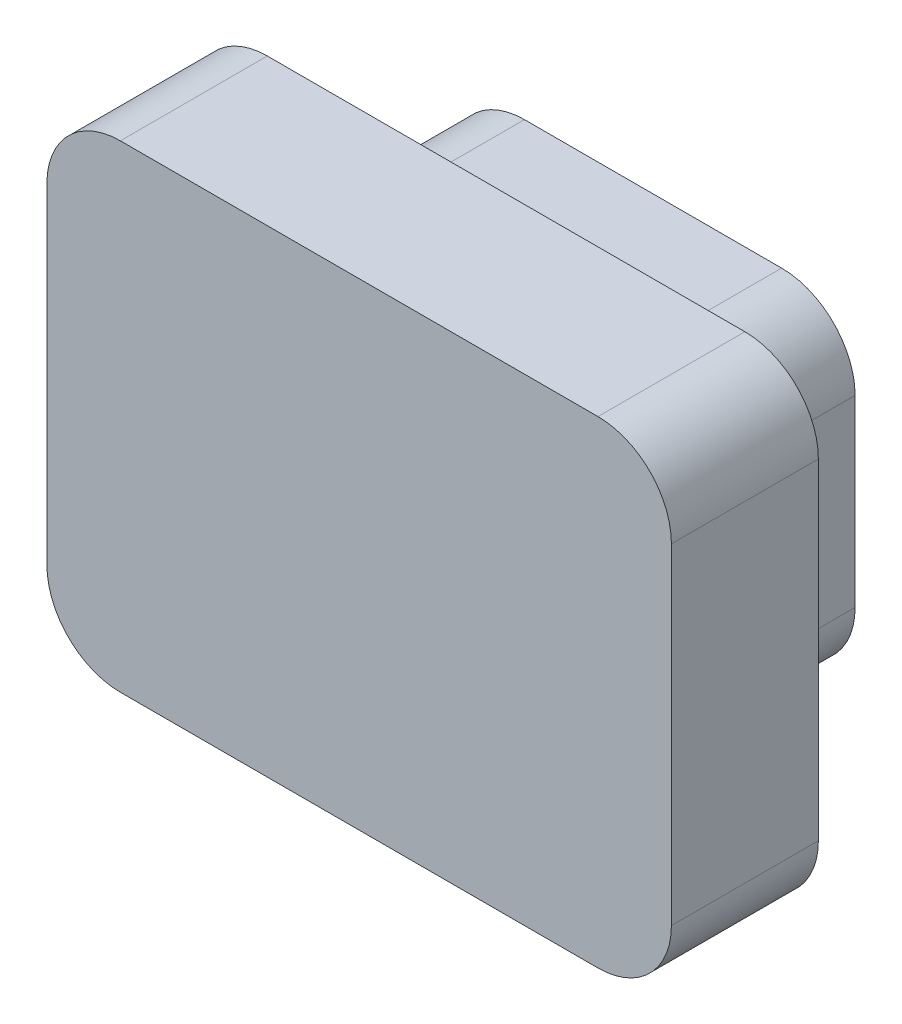
ISO-10303-21;
HEADER;
FILE_DESCRIPTION(('STEP AP214'),'2;1');
FILE_NAME('part.step','',(''),(''),'','','');
FILE_SCHEMA(('AUTOMOTIVE_DESIGN { 1 0 10303 214 1 1 1 1 }'));
ENDSEC;
DATA;
#1=APPLICATION_CONTEXT('core data for automotive mechanical design processes');
#2=APPLICATION_PROTOCOL_DEFINITION('international standard','automotive_design',2000,#1);
#3=PRODUCT_CONTEXT('',#1,'mechanical');
#4=PRODUCT('Part','Part','',(#3));
#5=PRODUCT_RELATED_PRODUCT_CATEGORY('part','',(#4));
#6=PRODUCT_DEFINITION_FORMATION('','',#4);
#7=PRODUCT_DEFINITION_CONTEXT('part definition',#1,'design');
#8=PRODUCT_DEFINITION('design','',#6,#7);
#9=PRODUCT_DEFINITION_SHAPE('','',#8);
#10=(LENGTH_UNIT() NAMED_UNIT(*) SI_UNIT(.MILLI.,.METRE.));
#11=(NAMED_UNIT(*) PLANE_ANGLE_UNIT() SI_UNIT($,.RADIAN.));
#12=(NAMED_UNIT(*) SI_UNIT($,.STERADIAN.) SOLID_ANGLE_UNIT());
#13=UNCERTAINTY_MEASURE_WITH_UNIT(LENGTH_MEASURE(1.E-05),#10,'distance_accuracy_value','');
#14=(GEOMETRIC_REPRESENTATION_CONTEXT(3) GLOBAL_UNCERTAINTY_ASSIGNED_CONTEXT((#13)) GLOBAL_UNIT_ASSIGNED_CONTEXT((#10,
#11,#12)) REPRESENTATION_CONTEXT('',''));
#15=CARTESIAN_POINT('',(0.,0.,0.));
#16=DIRECTION('',(0.,0.,1.));
#17=DIRECTION('',(1.,0.,0.));
#18=AXIS2_PLACEMENT_3D('',#15,#16,#17);
#19=CARTESIAN_POINT('',(1.75,-1.25,2.));
#20=DIRECTION('',(0.,0.,-1.));
#21=DIRECTION('',(-1.,0.,0.));
#22=AXIS2_PLACEMENT_3D('',#19,#20,#21);
#23=CYLINDRICAL_SURFACE('',#22,1.);
#24=CARTESIAN_POINT('',(1.75,-1.25,0.));
#25=DIRECTION('',(0.,0.,1.));
#26=DIRECTION('',(1.,0.,0.));
#27=AXIS2_PLACEMENT_3D('',#24,#25,#26);
#28=CIRCLE('',#27,1.);
#29=CARTESIAN_POINT('',(1.75,-2.25,0.));
#30=VERTEX_POINT('',#29);
#31=CARTESIAN_POINT('',(2.75,-1.25,0.));
#32=VERTEX_POINT('',#31);
#33=EDGE_CURVE('E144',#30,#32,#28,.T.);
#34=ORIENTED_EDGE('',*,*,#33,.T.);
#35=DIRECTION('',(0.,0.,-1.));
#36=VECTOR('',#35,1.);
#37=CARTESIAN_POINT('',(2.75,-1.25,2.));
#38=LINE('',#37,#36);
#39=CARTESIAN_POINT('',(2.75,-1.25,2.));
#40=VERTEX_POINT('',#39);
#41=EDGE_CURVE('E11',#40,#32,#38,.T.);
#42=ORIENTED_EDGE('',*,*,#41,.F.);
#43=CARTESIAN_POINT('',(1.75,-1.25,2.));
#44=DIRECTION('',(0.,0.,1.));
#45=DIRECTION('',(1.,0.,0.));
#46=AXIS2_PLACEMENT_3D('',#43,#44,#45);
#47=CIRCLE('',#46,1.);
#48=CARTESIAN_POINT('',(1.75,-2.25,2.));
#49=VERTEX_POINT('',#48);
#50=EDGE_CURVE('E159',#49,#40,#47,.T.);
#51=ORIENTED_EDGE('',*,*,#50,.F.);
#52=DIRECTION('',(0.,0.,-1.));
#53=VECTOR('',#52,1.);
#54=CARTESIAN_POINT('',(1.75,-2.25,2.));
#55=LINE('',#54,#53);
#56=EDGE_CURVE('E143',#49,#30,#55,.T.);
#57=ORIENTED_EDGE('',*,*,#56,.T.);
#58=EDGE_LOOP('',(#34,#42,#51,#57));
#59=FACE_BOUND('',#58,.T.);
#60=ADVANCED_FACE('F36',(#59),#23,.T.);
#61=CARTESIAN_POINT('',(2.75,-1.25,2.));
#62=DIRECTION('',(-1.,0.,0.));
#63=DIRECTION('',(0.,0.,1.));
#64=AXIS2_PLACEMENT_3D('',#61,#62,#63);
#65=PLANE('',#64);
#66=DIRECTION('',(0.,1.,0.));
#67=VECTOR('',#66,1.);
#68=CARTESIAN_POINT('',(2.75,-1.25,0.));
#69=LINE('',#68,#67);
#70=CARTESIAN_POINT('',(2.75,1.25,0.));
#71=VERTEX_POINT('',#70);
#72=EDGE_CURVE('E147',#32,#71,#69,.T.);
#73=ORIENTED_EDGE('',*,*,#72,.T.);
#74=DIRECTION('',(0.,0.,-1.));
#75=VECTOR('',#74,1.);
#76=CARTESIAN_POINT('',(2.75,1.25,2.));
#77=LINE('',#76,#75);
#78=CARTESIAN_POINT('',(2.75,1.25,2.));
#79=VERTEX_POINT('',#78);
#80=EDGE_CURVE('E44',#79,#71,#77,.T.);
#81=ORIENTED_EDGE('',*,*,#80,.F.);
#82=DIRECTION('',(0.,1.,0.));
#83=VECTOR('',#82,1.);
#84=CARTESIAN_POINT('',(2.75,-1.25,2.));
#85=LINE('',#84,#83);
#86=EDGE_CURVE('E94',#40,#79,#85,.T.);
#87=ORIENTED_EDGE('',*,*,#86,.F.);
#88=ORIENTED_EDGE('',*,*,#41,.T.);
#89=EDGE_LOOP('',(#73,#81,#87,#88));
#90=FACE_BOUND('',#89,.T.);
#91=ADVANCED_FACE('F305',(#90),#65,.F.);
#92=CARTESIAN_POINT('',(1.75,1.25,2.));
#93=DIRECTION('',(0.,0.,-1.));
#94=DIRECTION('',(-1.,0.,0.));
#95=AXIS2_PLACEMENT_3D('',#92,#93,#94);
#96=CYLINDRICAL_SURFACE('',#95,1.);
#97=CARTESIAN_POINT('',(1.75,1.25,0.));
#98=DIRECTION('',(0.,0.,1.));
#99=DIRECTION('',(1.,0.,0.));
#100=AXIS2_PLACEMENT_3D('',#97,#98,#99);
#101=CIRCLE('',#100,1.);
#102=CARTESIAN_POINT('',(1.75,2.25,0.));
#103=VERTEX_POINT('',#102);
#104=EDGE_CURVE('E150',#71,#103,#101,.T.);
#105=ORIENTED_EDGE('',*,*,#104,.T.);
#106=DIRECTION('',(0.,0.,-1.));
#107=VECTOR('',#106,1.);
#108=CARTESIAN_POINT('',(1.75,2.25,2.));
#109=LINE('',#108,#107);
#110=CARTESIAN_POINT('',(1.75,2.25,2.));
#111=VERTEX_POINT('',#110);
#112=EDGE_CURVE('E164',#111,#103,#109,.T.);
#113=ORIENTED_EDGE('',*,*,#112,.F.);
#114=CARTESIAN_POINT('',(1.75,1.25,2.));
#115=DIRECTION('',(0.,0.,1.));
#116=DIRECTION('',(1.,0.,0.));
#117=AXIS2_PLACEMENT_3D('',#114,#115,#116);
#118=CIRCLE('',#117,1.);
#119=EDGE_CURVE('E136',#79,#111,#118,.T.);
#120=ORIENTED_EDGE('',*,*,#119,.F.);
#121=ORIENTED_EDGE('',*,*,#80,.T.);
#122=EDGE_LOOP('',(#105,#113,#120,#121));
#123=FACE_BOUND('',#122,.T.);
#124=ADVANCED_FACE('F170',(#123),#96,.T.);
#125=CARTESIAN_POINT('',(-1.75,2.25,2.));
#126=DIRECTION('',(0.,-1.,0.));
#127=DIRECTION('',(0.,0.,-1.));
#128=AXIS2_PLACEMENT_3D('',#125,#126,#127);
#129=PLANE('',#128);
#130=DIRECTION('',(-1.,0.,0.));
#131=VECTOR('',#130,1.);
#132=CARTESIAN_POINT('',(-1.75,2.25,0.));
#133=LINE('',#132,#131);
#134=CARTESIAN_POINT('',(-1.75,2.25,0.));
#135=VERTEX_POINT('',#134);
#136=EDGE_CURVE('E152',#103,#135,#133,.T.);
#137=ORIENTED_EDGE('',*,*,#136,.T.);
#138=DIRECTION('',(0.,0.,-1.));
#139=VECTOR('',#138,1.);
#140=CARTESIAN_POINT('',(-1.75,2.25,2.));
#141=LINE('',#140,#139);
#142=CARTESIAN_POINT('',(-1.75,2.25,2.));
#143=VERTEX_POINT('',#142);
#144=EDGE_CURVE('E120',#143,#135,#141,.T.);
#145=ORIENTED_EDGE('',*,*,#144,.F.);
#146=DIRECTION('',(-1.,0.,0.));
#147=VECTOR('',#146,1.);
#148=CARTESIAN_POINT('',(-1.75,2.25,2.));
#149=LINE('',#148,#147);
#150=EDGE_CURVE('E134',#111,#143,#149,.T.);
#151=ORIENTED_EDGE('',*,*,#150,.F.);
#152=ORIENTED_EDGE('',*,*,#112,.T.);
#153=EDGE_LOOP('',(#137,#145,#151,#152));
#154=FACE_BOUND('',#153,.T.);
#155=ADVANCED_FACE('F176',(#154),#129,.F.);
#156=CARTESIAN_POINT('',(-1.75,1.25,2.));
#157=DIRECTION('',(0.,0.,-1.));
#158=DIRECTION('',(-1.,0.,0.));
#159=AXIS2_PLACEMENT_3D('',#156,#157,#158);
#160=CYLINDRICAL_SURFACE('',#159,1.);
#161=CARTESIAN_POINT('',(-1.75,1.25,0.));
#162=DIRECTION('',(0.,0.,1.));
#163=DIRECTION('',(-1.,0.,0.));
#164=AXIS2_PLACEMENT_3D('',#161,#162,#163);
#165=CIRCLE('',#164,1.);
#166=CARTESIAN_POINT('',(-2.75,1.25,0.));
#167=VERTEX_POINT('',#166);
#168=EDGE_CURVE('E117',#135,#167,#165,.T.);
#169=ORIENTED_EDGE('',*,*,#168,.T.);
#170=DIRECTION('',(0.,0.,-1.));
#171=VECTOR('',#170,1.);
#172=CARTESIAN_POINT('',(-2.75,1.25,2.));
#173=LINE('',#172,#171);
#174=CARTESIAN_POINT('',(-2.75,1.25,2.));
#175=VERTEX_POINT('',#174);
#176=EDGE_CURVE('E109',#175,#167,#173,.T.);
#177=ORIENTED_EDGE('',*,*,#176,.F.);
#178=CARTESIAN_POINT('',(-1.75,1.25,2.));
#179=DIRECTION('',(0.,0.,1.));
#180=DIRECTION('',(-1.,0.,0.));
#181=AXIS2_PLACEMENT_3D('',#178,#179,#180);
#182=CIRCLE('',#181,1.);
#183=EDGE_CURVE('E114',#143,#175,#182,.T.);
#184=ORIENTED_EDGE('',*,*,#183,.F.);
#185=ORIENTED_EDGE('',*,*,#144,.T.);
#186=EDGE_LOOP('',(#169,#177,#184,#185));
#187=FACE_BOUND('',#186,.T.);
#188=ADVANCED_FACE('F111',(#187),#160,.T.);
#189=CARTESIAN_POINT('',(-2.75,-1.25,2.));
#190=DIRECTION('',(1.,0.,0.));
#191=DIRECTION('',(0.,0.,-1.));
#192=AXIS2_PLACEMENT_3D('',#189,#190,#191);
#193=PLANE('',#192);
#194=DIRECTION('',(0.,-1.,0.));
#195=VECTOR('',#194,1.);
#196=CARTESIAN_POINT('',(-2.75,-1.25,0.));
#197=LINE('',#196,#195);
#198=CARTESIAN_POINT('',(-2.75,-1.25,0.));
#199=VERTEX_POINT('',#198);
#200=EDGE_CURVE('E155',#167,#199,#197,.T.);
#201=ORIENTED_EDGE('',*,*,#200,.T.);
#202=DIRECTION('',(0.,0.,-1.));
#203=VECTOR('',#202,1.);
#204=CARTESIAN_POINT('',(-2.75,-1.25,2.));
#205=LINE('',#204,#203);
#206=CARTESIAN_POINT('',(-2.75,-1.25,2.));
#207=VERTEX_POINT('',#206);
#208=EDGE_CURVE('E121',#207,#199,#205,.T.);
#209=ORIENTED_EDGE('',*,*,#208,.F.);
#210=DIRECTION('',(0.,-1.,0.));
#211=VECTOR('',#210,1.);
#212=CARTESIAN_POINT('',(-2.75,-1.25,2.));
#213=LINE('',#212,#211);
#214=EDGE_CURVE('E124',#175,#207,#213,.T.);
#215=ORIENTED_EDGE('',*,*,#214,.F.);
#216=ORIENTED_EDGE('',*,*,#176,.T.);
#217=EDGE_LOOP('',(#201,#209,#215,#216));
#218=FACE_BOUND('',#217,.T.);
#219=ADVANCED_FACE('F125',(#218),#193,.F.);
#220=CARTESIAN_POINT('',(-1.75,-1.25,2.));
#221=DIRECTION('',(0.,0.,-1.));
#222=DIRECTION('',(-1.,0.,0.));
#223=AXIS2_PLACEMENT_3D('',#220,#221,#222);
#224=CYLINDRICAL_SURFACE('',#223,1.);
#225=CARTESIAN_POINT('',(-1.75,-1.25,0.));
#226=DIRECTION('',(0.,0.,1.));
#227=DIRECTION('',(-1.,0.,0.));
#228=AXIS2_PLACEMENT_3D('',#225,#226,#227);
#229=CIRCLE('',#228,1.);
#230=CARTESIAN_POINT('',(-1.75,-2.25,0.));
#231=VERTEX_POINT('',#230);
#232=EDGE_CURVE('E80',#199,#231,#229,.T.);
#233=ORIENTED_EDGE('',*,*,#232,.T.);
#234=DIRECTION('',(0.,0.,-1.));
#235=VECTOR('',#234,1.);
#236=CARTESIAN_POINT('',(-1.75,-2.25,2.));
#237=LINE('',#236,#235);
#238=CARTESIAN_POINT('',(-1.75,-2.25,2.));
#239=VERTEX_POINT('',#238);
#240=EDGE_CURVE('E52',#239,#231,#237,.T.);
#241=ORIENTED_EDGE('',*,*,#240,.F.);
#242=CARTESIAN_POINT('',(-1.75,-1.25,2.));
#243=DIRECTION('',(0.,0.,1.));
#244=DIRECTION('',(-1.,0.,0.));
#245=AXIS2_PLACEMENT_3D('',#242,#243,#244);
#246=CIRCLE('',#245,1.);
#247=EDGE_CURVE('E128',#207,#239,#246,.T.);
#248=ORIENTED_EDGE('',*,*,#247,.F.);
#249=ORIENTED_EDGE('',*,*,#208,.T.);
#250=EDGE_LOOP('',(#233,#241,#248,#249));
#251=FACE_BOUND('',#250,.T.);
#252=ADVANCED_FACE('F311',(#251),#224,.T.);
#253=CARTESIAN_POINT('',(-1.75,-2.25,2.));
#254=DIRECTION('',(0.,1.,0.));
#255=DIRECTION('',(0.,0.,1.));
#256=AXIS2_PLACEMENT_3D('',#253,#254,#255);
#257=PLANE('',#256);
#258=DIRECTION('',(1.,0.,0.));
#259=VECTOR('',#258,1.);
#260=CARTESIAN_POINT('',(-1.75,-2.25,0.));
#261=LINE('',#260,#259);
#262=EDGE_CURVE('E86',#231,#30,#261,.T.);
#263=ORIENTED_EDGE('',*,*,#262,.T.);
#264=ORIENTED_EDGE('',*,*,#56,.F.);
#265=DIRECTION('',(1.,0.,0.));
#266=VECTOR('',#265,1.);
#267=CARTESIAN_POINT('',(-1.75,-2.25,2.));
#268=LINE('',#267,#266);
#269=EDGE_CURVE('E141',#239,#49,#268,.T.);
#270=ORIENTED_EDGE('',*,*,#269,.F.);
#271=ORIENTED_EDGE('',*,*,#240,.T.);
#272=EDGE_LOOP('',(#263,#264,#270,#271));
#273=FACE_BOUND('',#272,.T.);
#274=ADVANCED_FACE('F300',(#273),#257,.F.);
#275=CARTESIAN_POINT('',(1.75,-1.25,0.));
#276=DIRECTION('',(0.,0.,1.));
#277=DIRECTION('',(1.,0.,0.));
#278=AXIS2_PLACEMENT_3D('',#275,#276,#277);
#279=PLANE('',#278);
#280=ORIENTED_EDGE('',*,*,#33,.F.);
#281=ORIENTED_EDGE('',*,*,#262,.F.);
#282=ORIENTED_EDGE('',*,*,#232,.F.);
#283=ORIENTED_EDGE('',*,*,#200,.F.);
#284=ORIENTED_EDGE('',*,*,#168,.F.);
#285=ORIENTED_EDGE('',*,*,#136,.F.);
#286=ORIENTED_EDGE('',*,*,#104,.F.);
#287=ORIENTED_EDGE('',*,*,#72,.F.);
#288=EDGE_LOOP('',(#280,#281,#282,#283,#284,#285,#286,#287));
#289=FACE_BOUND('',#288,.T.);
#290=ADVANCED_FACE('F174',(#289),#279,.F.);
#291=CARTESIAN_POINT('',(-3.25,-2.25,2.));
#292=DIRECTION('',(0.,0.,1.));
#293=DIRECTION('',(1.,0.,0.));
#294=AXIS2_PLACEMENT_3D('',#291,#292,#293);
#295=PLANE('',#294);
#296=CARTESIAN_POINT('',(-3.25,-2.25,2.));
#297=DIRECTION('',(0.,0.,1.));
#298=DIRECTION('',(1.,0.,0.));
#299=AXIS2_PLACEMENT_3D('',#296,#297,#298);
#300=CIRCLE('',#299,1.);
#301=CARTESIAN_POINT('',(-4.25,-2.25,2.));
#302=VERTEX_POINT('',#301);
#303=CARTESIAN_POINT('',(-3.25,-3.25,2.));
#304=VERTEX_POINT('',#303);
#305=EDGE_CURVE('E227',#302,#304,#300,.T.);
#306=ORIENTED_EDGE('',*,*,#305,.F.);
#307=DIRECTION('',(0.,-1.,0.));
#308=VECTOR('',#307,1.);
#309=CARTESIAN_POINT('',(-4.25,-2.25,2.));
#310=LINE('',#309,#308);
#311=CARTESIAN_POINT('',(-4.25,2.25,2.));
#312=VERTEX_POINT('',#311);
#313=EDGE_CURVE('E205',#312,#302,#310,.T.);
#314=ORIENTED_EDGE('',*,*,#313,.F.);
#315=CARTESIAN_POINT('',(-3.25,2.25,2.));
#316=DIRECTION('',(0.,0.,1.));
#317=DIRECTION('',(-1.,0.,0.));
#318=AXIS2_PLACEMENT_3D('',#315,#316,#317);
#319=CIRCLE('',#318,1.);
#320=CARTESIAN_POINT('',(-3.25,3.25,2.));
#321=VERTEX_POINT('',#320);
#322=EDGE_CURVE('E209',#321,#312,#319,.T.);
#323=ORIENTED_EDGE('',*,*,#322,.F.);
#324=DIRECTION('',(-1.,0.,0.));
#325=VECTOR('',#324,1.);
#326=CARTESIAN_POINT('',(-3.25,3.25,2.));
#327=LINE('',#326,#325);
#328=CARTESIAN_POINT('',(3.25,3.25,2.));
#329=VERTEX_POINT('',#328);
#330=EDGE_CURVE('E212',#329,#321,#327,.T.);
#331=ORIENTED_EDGE('',*,*,#330,.F.);
#332=CARTESIAN_POINT('',(3.25,2.25,2.));
#333=DIRECTION('',(0.,0.,1.));
#334=DIRECTION('',(1.,0.,0.));
#335=AXIS2_PLACEMENT_3D('',#332,#333,#334);
#336=CIRCLE('',#335,1.);
#337=CARTESIAN_POINT('',(4.25,2.25,2.));
#338=VERTEX_POINT('',#337);
#339=EDGE_CURVE('E215',#338,#329,#336,.T.);
#340=ORIENTED_EDGE('',*,*,#339,.F.);
#341=DIRECTION('',(0.,1.,0.));
#342=VECTOR('',#341,1.);
#343=CARTESIAN_POINT('',(4.25,-2.25,2.));
#344=LINE('',#343,#342);
#345=CARTESIAN_POINT('',(4.25,-2.25,2.));
#346=VERTEX_POINT('',#345);
#347=EDGE_CURVE('E218',#346,#338,#344,.T.);
#348=ORIENTED_EDGE('',*,*,#347,.F.);
#349=CARTESIAN_POINT('',(3.25,-2.25,2.));
#350=DIRECTION('',(0.,0.,1.));
#351=DIRECTION('',(1.,0.,0.));
#352=AXIS2_PLACEMENT_3D('',#349,#350,#351);
#353=CIRCLE('',#352,1.);
#354=CARTESIAN_POINT('',(3.25,-3.25,2.));
#355=VERTEX_POINT('',#354);
#356=EDGE_CURVE('E221',#355,#346,#353,.T.);
#357=ORIENTED_EDGE('',*,*,#356,.F.);
#358=DIRECTION('',(1.,0.,0.));
#359=VECTOR('',#358,1.);
#360=CARTESIAN_POINT('',(-3.25,-3.25,2.));
#361=LINE('',#360,#359);
#362=EDGE_CURVE('E224',#304,#355,#361,.T.);
#363=ORIENTED_EDGE('',*,*,#362,.F.);
#364=EDGE_LOOP('',(#306,#314,#323,#331,#340,#348,#357,#363));
#365=FACE_BOUND('',#364,.T.);
#366=ORIENTED_EDGE('',*,*,#269,.T.);
#367=ORIENTED_EDGE('',*,*,#50,.T.);
#368=ORIENTED_EDGE('',*,*,#86,.T.);
#369=ORIENTED_EDGE('',*,*,#119,.T.);
#370=ORIENTED_EDGE('',*,*,#150,.T.);
#371=ORIENTED_EDGE('',*,*,#183,.T.);
#372=ORIENTED_EDGE('',*,*,#214,.T.);
#373=ORIENTED_EDGE('',*,*,#247,.T.);
#374=EDGE_LOOP('',(#366,#367,#368,#369,#370,#371,#372,#373));
#375=FACE_BOUND('',#374,.T.);
#376=ADVANCED_FACE('F131',(#365,#375),#295,.F.);
#377=CARTESIAN_POINT('',(-3.25,-2.25,4.));
#378=DIRECTION('',(0.,0.,-1.));
#379=DIRECTION('',(-1.,0.,0.));
#380=AXIS2_PLACEMENT_3D('',#377,#378,#379);
#381=CYLINDRICAL_SURFACE('',#380,1.);
#382=ORIENTED_EDGE('',*,*,#305,.T.);
#383=DIRECTION('',(0.,0.,-1.));
#384=VECTOR('',#383,1.);
#385=CARTESIAN_POINT('',(-3.25,-3.25,4.));
#386=LINE('',#385,#384);
#387=CARTESIAN_POINT('',(-3.25,-3.25,4.));
#388=VERTEX_POINT('',#387);
#389=EDGE_CURVE('E148',#388,#304,#386,.T.);
#390=ORIENTED_EDGE('',*,*,#389,.F.);
#391=CARTESIAN_POINT('',(-3.25,-2.25,4.));
#392=DIRECTION('',(0.,0.,1.));
#393=DIRECTION('',(1.,0.,0.));
#394=AXIS2_PLACEMENT_3D('',#391,#392,#393);
#395=CIRCLE('',#394,1.);
#396=CARTESIAN_POINT('',(-4.25,-2.25,4.));
#397=VERTEX_POINT('',#396);
#398=EDGE_CURVE('E208',#397,#388,#395,.T.);
#399=ORIENTED_EDGE('',*,*,#398,.F.);
#400=DIRECTION('',(0.,0.,-1.));
#401=VECTOR('',#400,1.);
#402=CARTESIAN_POINT('',(-4.25,-2.25,4.));
#403=LINE('',#402,#401);
#404=EDGE_CURVE('E201',#397,#302,#403,.T.);
#405=ORIENTED_EDGE('',*,*,#404,.T.);
#406=EDGE_LOOP('',(#382,#390,#399,#405));
#407=FACE_BOUND('',#406,.T.);
#408=ADVANCED_FACE('F265',(#407),#381,.T.);
#409=CARTESIAN_POINT('',(-3.25,-3.25,4.));
#410=DIRECTION('',(0.,1.,0.));
#411=DIRECTION('',(0.,0.,1.));
#412=AXIS2_PLACEMENT_3D('',#409,#410,#411);
#413=PLANE('',#412);
#414=ORIENTED_EDGE('',*,*,#362,.T.);
#415=DIRECTION('',(0.,0.,-1.));
#416=VECTOR('',#415,1.);
#417=CARTESIAN_POINT('',(3.25,-3.25,4.));
#418=LINE('',#417,#416);
#419=CARTESIAN_POINT('',(3.25,-3.25,4.));
#420=VERTEX_POINT('',#419);
#421=EDGE_CURVE('E183',#420,#355,#418,.T.);
#422=ORIENTED_EDGE('',*,*,#421,.F.);
#423=DIRECTION('',(1.,0.,0.));
#424=VECTOR('',#423,1.);
#425=CARTESIAN_POINT('',(-3.25,-3.25,4.));
#426=LINE('',#425,#424);
#427=EDGE_CURVE('E247',#388,#420,#426,.T.);
#428=ORIENTED_EDGE('',*,*,#427,.F.);
#429=ORIENTED_EDGE('',*,*,#389,.T.);
#430=EDGE_LOOP('',(#414,#422,#428,#429));
#431=FACE_BOUND('',#430,.T.);
#432=ADVANCED_FACE('F269',(#431),#413,.F.);
#433=CARTESIAN_POINT('',(3.25,-2.25,4.));
#434=DIRECTION('',(0.,0.,-1.));
#435=DIRECTION('',(-1.,0.,0.));
#436=AXIS2_PLACEMENT_3D('',#433,#434,#435);
#437=CYLINDRICAL_SURFACE('',#436,1.);
#438=ORIENTED_EDGE('',*,*,#356,.T.);
#439=DIRECTION('',(0.,0.,-1.));
#440=VECTOR('',#439,1.);
#441=CARTESIAN_POINT('',(4.25,-2.25,4.));
#442=LINE('',#441,#440);
#443=CARTESIAN_POINT('',(4.25,-2.25,4.));
#444=VERTEX_POINT('',#443);
#445=EDGE_CURVE('E186',#444,#346,#442,.T.);
#446=ORIENTED_EDGE('',*,*,#445,.F.);
#447=CARTESIAN_POINT('',(3.25,-2.25,4.));
#448=DIRECTION('',(0.,0.,1.));
#449=DIRECTION('',(1.,0.,0.));
#450=AXIS2_PLACEMENT_3D('',#447,#448,#449);
#451=CIRCLE('',#450,1.);
#452=EDGE_CURVE('E244',#420,#444,#451,.T.);
#453=ORIENTED_EDGE('',*,*,#452,.F.);
#454=ORIENTED_EDGE('',*,*,#421,.T.);
#455=EDGE_LOOP('',(#438,#446,#453,#454));
#456=FACE_BOUND('',#455,.T.);
#457=ADVANCED_FACE('F370',(#456),#437,.T.);
#458=CARTESIAN_POINT('',(4.25,-2.25,4.));
#459=DIRECTION('',(-1.,0.,0.));
#460=DIRECTION('',(0.,0.,1.));
#461=AXIS2_PLACEMENT_3D('',#458,#459,#460);
#462=PLANE('',#461);
#463=ORIENTED_EDGE('',*,*,#347,.T.);
#464=DIRECTION('',(0.,0.,-1.));
#465=VECTOR('',#464,1.);
#466=CARTESIAN_POINT('',(4.25,2.25,4.));
#467=LINE('',#466,#465);
#468=CARTESIAN_POINT('',(4.25,2.25,4.));
#469=VERTEX_POINT('',#468);
#470=EDGE_CURVE('E189',#469,#338,#467,.T.);
#471=ORIENTED_EDGE('',*,*,#470,.F.);
#472=DIRECTION('',(0.,1.,0.));
#473=VECTOR('',#472,1.);
#474=CARTESIAN_POINT('',(4.25,-2.25,4.));
#475=LINE('',#474,#473);
#476=EDGE_CURVE('E241',#444,#469,#475,.T.);
#477=ORIENTED_EDGE('',*,*,#476,.F.);
#478=ORIENTED_EDGE('',*,*,#445,.T.);
#479=EDGE_LOOP('',(#463,#471,#477,#478));
#480=FACE_BOUND('',#479,.T.);
#481=ADVANCED_FACE('F379',(#480),#462,.F.);
#482=CARTESIAN_POINT('',(3.25,2.25,4.));
#483=DIRECTION('',(0.,0.,-1.));
#484=DIRECTION('',(-1.,0.,0.));
#485=AXIS2_PLACEMENT_3D('',#482,#483,#484);
#486=CYLINDRICAL_SURFACE('',#485,1.);
#487=ORIENTED_EDGE('',*,*,#339,.T.);
#488=DIRECTION('',(0.,0.,-1.));
#489=VECTOR('',#488,1.);
#490=CARTESIAN_POINT('',(3.25,3.25,4.));
#491=LINE('',#490,#489);
#492=CARTESIAN_POINT('',(3.25,3.25,4.));
#493=VERTEX_POINT('',#492);
#494=EDGE_CURVE('E192',#493,#329,#491,.T.);
#495=ORIENTED_EDGE('',*,*,#494,.F.);
#496=CARTESIAN_POINT('',(3.25,2.25,4.));
#497=DIRECTION('',(0.,0.,1.));
#498=DIRECTION('',(1.,0.,0.));
#499=AXIS2_PLACEMENT_3D('',#496,#497,#498);
#500=CIRCLE('',#499,1.);
#501=EDGE_CURVE('E238',#469,#493,#500,.T.);
#502=ORIENTED_EDGE('',*,*,#501,.F.);
#503=ORIENTED_EDGE('',*,*,#470,.T.);
#504=EDGE_LOOP('',(#487,#495,#502,#503));
#505=FACE_BOUND('',#504,.T.);
#506=ADVANCED_FACE('F389',(#505),#486,.T.);
#507=CARTESIAN_POINT('',(-3.25,3.25,4.));
#508=DIRECTION('',(0.,-1.,0.));
#509=DIRECTION('',(0.,0.,-1.));
#510=AXIS2_PLACEMENT_3D('',#507,#508,#509);
#511=PLANE('',#510);
#512=ORIENTED_EDGE('',*,*,#330,.T.);
#513=DIRECTION('',(0.,0.,-1.));
#514=VECTOR('',#513,1.);
#515=CARTESIAN_POINT('',(-3.25,3.25,4.));
#516=LINE('',#515,#514);
#517=CARTESIAN_POINT('',(-3.25,3.25,4.));
#518=VERTEX_POINT('',#517);
#519=EDGE_CURVE('E195',#518,#321,#516,.T.);
#520=ORIENTED_EDGE('',*,*,#519,.F.);
#521=DIRECTION('',(-1.,0.,0.));
#522=VECTOR('',#521,1.);
#523=CARTESIAN_POINT('',(-3.25,3.25,4.));
#524=LINE('',#523,#522);
#525=EDGE_CURVE('E235',#493,#518,#524,.T.);
#526=ORIENTED_EDGE('',*,*,#525,.F.);
#527=ORIENTED_EDGE('',*,*,#494,.T.);
#528=EDGE_LOOP('',(#512,#520,#526,#527));
#529=FACE_BOUND('',#528,.T.);
#530=ADVANCED_FACE('F399',(#529),#511,.F.);
#531=CARTESIAN_POINT('',(-3.25,2.25,4.));
#532=DIRECTION('',(0.,0.,-1.));
#533=DIRECTION('',(-1.,0.,0.));
#534=AXIS2_PLACEMENT_3D('',#531,#532,#533);
#535=CYLINDRICAL_SURFACE('',#534,1.);
#536=ORIENTED_EDGE('',*,*,#322,.T.);
#537=DIRECTION('',(0.,0.,-1.));
#538=VECTOR('',#537,1.);
#539=CARTESIAN_POINT('',(-4.25,2.25,4.));
#540=LINE('',#539,#538);
#541=CARTESIAN_POINT('',(-4.25,2.25,4.));
#542=VERTEX_POINT('',#541);
#543=EDGE_CURVE('E198',#542,#312,#540,.T.);
#544=ORIENTED_EDGE('',*,*,#543,.F.);
#545=CARTESIAN_POINT('',(-3.25,2.25,4.));
#546=DIRECTION('',(0.,0.,1.));
#547=DIRECTION('',(-1.,0.,0.));
#548=AXIS2_PLACEMENT_3D('',#545,#546,#547);
#549=CIRCLE('',#548,1.);
#550=EDGE_CURVE('E232',#518,#542,#549,.T.);
#551=ORIENTED_EDGE('',*,*,#550,.F.);
#552=ORIENTED_EDGE('',*,*,#519,.T.);
#553=EDGE_LOOP('',(#536,#544,#551,#552));
#554=FACE_BOUND('',#553,.T.);
#555=ADVANCED_FACE('F409',(#554),#535,.T.);
#556=CARTESIAN_POINT('',(-4.25,-2.25,4.));
#557=DIRECTION('',(1.,0.,0.));
#558=DIRECTION('',(0.,0.,-1.));
#559=AXIS2_PLACEMENT_3D('',#556,#557,#558);
#560=PLANE('',#559);
#561=ORIENTED_EDGE('',*,*,#313,.T.);
#562=ORIENTED_EDGE('',*,*,#404,.F.);
#563=DIRECTION('',(0.,-1.,0.));
#564=VECTOR('',#563,1.);
#565=CARTESIAN_POINT('',(-4.25,-2.25,4.));
#566=LINE('',#565,#564);
#567=EDGE_CURVE('E204',#542,#397,#566,.T.);
#568=ORIENTED_EDGE('',*,*,#567,.F.);
#569=ORIENTED_EDGE('',*,*,#543,.T.);
#570=EDGE_LOOP('',(#561,#562,#568,#569));
#571=FACE_BOUND('',#570,.T.);
#572=ADVANCED_FACE('F290',(#571),#560,.F.);
#573=CARTESIAN_POINT('',(-3.25,-2.25,4.));
#574=DIRECTION('',(0.,0.,1.));
#575=DIRECTION('',(1.,0.,0.));
#576=AXIS2_PLACEMENT_3D('',#573,#574,#575);
#577=PLANE('',#576);
#578=ORIENTED_EDGE('',*,*,#398,.T.);
#579=ORIENTED_EDGE('',*,*,#427,.T.);
#580=ORIENTED_EDGE('',*,*,#452,.T.);
#581=ORIENTED_EDGE('',*,*,#476,.T.);
#582=ORIENTED_EDGE('',*,*,#501,.T.);
#583=ORIENTED_EDGE('',*,*,#525,.T.);
#584=ORIENTED_EDGE('',*,*,#550,.T.);
#585=ORIENTED_EDGE('',*,*,#567,.T.);
#586=EDGE_LOOP('',(#578,#579,#580,#581,#582,#583,#584,#585));
#587=FACE_BOUND('',#586,.T.);
#588=ADVANCED_FACE('F255',(#587),#577,.T.);
#589=CLOSED_SHELL('',(#60,#91,#124,#155,#188,#219,#252,#274,#290,#376,#408,#432,#457,#481,#506,
#530,#555,#572,#588));
#590=MANIFOLD_SOLID_BREP('B2',#589);
#591=ADVANCED_BREP_SHAPE_REPRESENTATION('',(#18,#590),#14);
#592=SHAPE_DEFINITION_REPRESENTATION(#9,#591);
ENDSEC;
END-ISO-10303-21;
